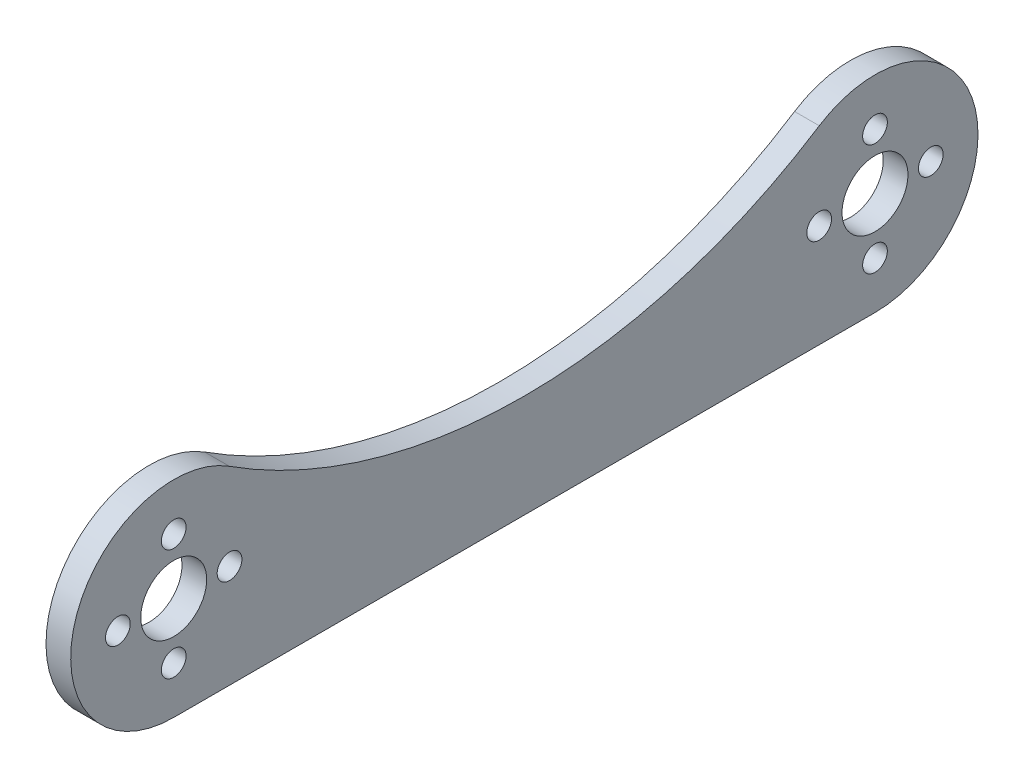
ISO-10303-21;
HEADER;
FILE_DESCRIPTION(('STEP AP214'),'2;1');
FILE_NAME('part.step','',(''),(''),'','','');
FILE_SCHEMA(('AUTOMOTIVE_DESIGN { 1 0 10303 214 1 1 1 1 }'));
ENDSEC;
DATA;
#1=APPLICATION_CONTEXT('core data for automotive mechanical design processes');
#2=APPLICATION_PROTOCOL_DEFINITION('international standard','automotive_design',2000,#1);
#3=PRODUCT_CONTEXT('',#1,'mechanical');
#4=PRODUCT('Part','Part','',(#3));
#5=PRODUCT_RELATED_PRODUCT_CATEGORY('part','',(#4));
#6=PRODUCT_DEFINITION_FORMATION('','',#4);
#7=PRODUCT_DEFINITION_CONTEXT('part definition',#1,'design');
#8=PRODUCT_DEFINITION('design','',#6,#7);
#9=PRODUCT_DEFINITION_SHAPE('','',#8);
#10=(LENGTH_UNIT() NAMED_UNIT(*) SI_UNIT(.MILLI.,.METRE.));
#11=(NAMED_UNIT(*) PLANE_ANGLE_UNIT() SI_UNIT($,.RADIAN.));
#12=(NAMED_UNIT(*) SI_UNIT($,.STERADIAN.) SOLID_ANGLE_UNIT());
#13=UNCERTAINTY_MEASURE_WITH_UNIT(LENGTH_MEASURE(1.E-05),#10,'distance_accuracy_value','');
#14=(GEOMETRIC_REPRESENTATION_CONTEXT(3) GLOBAL_UNCERTAINTY_ASSIGNED_CONTEXT((#13)) GLOBAL_UNIT_ASSIGNED_CONTEXT((#10,
#11,#12)) REPRESENTATION_CONTEXT('',''));
#15=CARTESIAN_POINT('',(0.,0.,0.));
#16=DIRECTION('',(0.,0.,1.));
#17=DIRECTION('',(1.,0.,0.));
#18=AXIS2_PLACEMENT_3D('',#15,#16,#17);
#19=CARTESIAN_POINT('',(3.,66.1701000000001,0.));
#20=DIRECTION('',(1.,0.,0.));
#21=DIRECTION('',(0.,0.,-1.));
#22=AXIS2_PLACEMENT_3D('',#19,#20,#21);
#23=PLANE('',#22);
#24=CARTESIAN_POINT('',(3.,0.,-35.775));
#25=DIRECTION('',(1.,0.,0.));
#26=DIRECTION('',(0.,0.,1.));
#27=AXIS2_PLACEMENT_3D('',#24,#25,#26);
#28=CIRCLE('',#27,1.5);
#29=CARTESIAN_POINT('',(3.,0.,-34.275));
#30=VERTEX_POINT('',#29);
#31=EDGE_CURVE('E190',#30,#30,#28,.T.);
#32=ORIENTED_EDGE('',*,*,#31,.F.);
#33=EDGE_LOOP('',(#32));
#34=FACE_BOUND('',#33,.T.);
#35=CARTESIAN_POINT('',(3.,0.,-49.325));
#36=DIRECTION('',(1.,0.,0.));
#37=DIRECTION('',(0.,0.,1.));
#38=AXIS2_PLACEMENT_3D('',#35,#36,#37);
#39=CIRCLE('',#38,1.5);
#40=CARTESIAN_POINT('',(3.,0.,-47.825));
#41=VERTEX_POINT('',#40);
#42=EDGE_CURVE('E174',#41,#41,#39,.T.);
#43=ORIENTED_EDGE('',*,*,#42,.F.);
#44=EDGE_LOOP('',(#43));
#45=FACE_BOUND('',#44,.T.);
#46=CARTESIAN_POINT('',(3.,6.77499999999998,42.55));
#47=DIRECTION('',(1.,0.,0.));
#48=DIRECTION('',(0.,0.,-1.));
#49=AXIS2_PLACEMENT_3D('',#46,#47,#48);
#50=CIRCLE('',#49,1.5);
#51=CARTESIAN_POINT('',(3.,6.77499999999998,41.05));
#52=VERTEX_POINT('',#51);
#53=EDGE_CURVE('E158',#52,#52,#50,.T.);
#54=ORIENTED_EDGE('',*,*,#53,.F.);
#55=EDGE_LOOP('',(#54));
#56=FACE_BOUND('',#55,.T.);
#57=CARTESIAN_POINT('',(3.,-6.77500000000003,42.55));
#58=DIRECTION('',(1.,0.,0.));
#59=DIRECTION('',(0.,0.,-1.));
#60=AXIS2_PLACEMENT_3D('',#57,#58,#59);
#61=CIRCLE('',#60,1.5);
#62=CARTESIAN_POINT('',(3.,-6.77500000000003,41.05));
#63=VERTEX_POINT('',#62);
#64=EDGE_CURVE('E142',#63,#63,#61,.T.);
#65=ORIENTED_EDGE('',*,*,#64,.F.);
#66=EDGE_LOOP('',(#65));
#67=FACE_BOUND('',#66,.T.);
#68=CARTESIAN_POINT('',(3.,0.,42.55));
#69=DIRECTION('',(1.,0.,0.));
#70=DIRECTION('',(0.,0.,-1.));
#71=AXIS2_PLACEMENT_3D('',#68,#69,#70);
#72=CIRCLE('',#71,4.00000000000001);
#73=CARTESIAN_POINT('',(3.,0.,38.55));
#74=VERTEX_POINT('',#73);
#75=EDGE_CURVE('E112',#74,#74,#72,.T.);
#76=ORIENTED_EDGE('',*,*,#75,.F.);
#77=EDGE_LOOP('',(#76));
#78=FACE_BOUND('',#77,.T.);
#79=CARTESIAN_POINT('',(3.,66.1701000000001,0.));
#80=DIRECTION('',(-1.,0.,0.));
#81=DIRECTION('',(0.,0.,-1.));
#82=AXIS2_PLACEMENT_3D('',#79,#80,#81);
#83=CIRCLE('',#82,66.1701000000001);
#84=CARTESIAN_POINT('',(3.,10.5138578697625,-35.7891721886714));
#85=VERTEX_POINT('',#84);
#86=CARTESIAN_POINT('',(3.,10.5138578697625,35.7891721886714));
#87=VERTEX_POINT('',#86);
#88=EDGE_CURVE('E92',#85,#87,#83,.T.);
#89=ORIENTED_EDGE('',*,*,#88,.T.);
#90=CARTESIAN_POINT('',(3.,0.,42.55));
#91=DIRECTION('',(1.,0.,0.));
#92=DIRECTION('',(0.,0.,-1.));
#93=AXIS2_PLACEMENT_3D('',#90,#91,#92);
#94=CIRCLE('',#93,12.5);
#95=CARTESIAN_POINT('',(3.,-12.5,42.55));
#96=VERTEX_POINT('',#95);
#97=EDGE_CURVE('E87',#87,#96,#94,.T.);
#98=ORIENTED_EDGE('',*,*,#97,.T.);
#99=DIRECTION('',(0.,0.,-1.));
#100=VECTOR('',#99,1.);
#101=CARTESIAN_POINT('',(3.,-12.5,42.55));
#102=LINE('',#101,#100);
#103=CARTESIAN_POINT('',(3.,-12.5,-42.55));
#104=VERTEX_POINT('',#103);
#105=EDGE_CURVE('E90',#96,#104,#102,.T.);
#106=ORIENTED_EDGE('',*,*,#105,.T.);
#107=CARTESIAN_POINT('',(3.,0.,-42.55));
#108=DIRECTION('',(1.,0.,0.));
#109=DIRECTION('',(0.,0.,1.));
#110=AXIS2_PLACEMENT_3D('',#107,#108,#109);
#111=CIRCLE('',#110,12.5);
#112=EDGE_CURVE('E57',#104,#85,#111,.T.);
#113=ORIENTED_EDGE('',*,*,#112,.T.);
#114=EDGE_LOOP('',(#89,#98,#106,#113));
#115=FACE_BOUND('',#114,.T.);
#116=CARTESIAN_POINT('',(3.,0.,35.775));
#117=DIRECTION('',(1.,0.,0.));
#118=DIRECTION('',(0.,0.,-1.));
#119=AXIS2_PLACEMENT_3D('',#116,#117,#118);
#120=CIRCLE('',#119,1.5);
#121=CARTESIAN_POINT('',(3.,0.,34.275));
#122=VERTEX_POINT('',#121);
#123=EDGE_CURVE('E134',#122,#122,#120,.T.);
#124=ORIENTED_EDGE('',*,*,#123,.F.);
#125=EDGE_LOOP('',(#124));
#126=FACE_BOUND('',#125,.T.);
#127=CARTESIAN_POINT('',(3.,0.,49.325));
#128=DIRECTION('',(1.,0.,0.));
#129=DIRECTION('',(0.,0.,-1.));
#130=AXIS2_PLACEMENT_3D('',#127,#128,#129);
#131=CIRCLE('',#130,1.49999999999999);
#132=CARTESIAN_POINT('',(3.,0.,47.825));
#133=VERTEX_POINT('',#132);
#134=EDGE_CURVE('E150',#133,#133,#131,.T.);
#135=ORIENTED_EDGE('',*,*,#134,.F.);
#136=EDGE_LOOP('',(#135));
#137=FACE_BOUND('',#136,.T.);
#138=CARTESIAN_POINT('',(3.,6.77499999999999,-42.55));
#139=DIRECTION('',(1.,0.,0.));
#140=DIRECTION('',(0.,0.,1.));
#141=AXIS2_PLACEMENT_3D('',#138,#139,#140);
#142=CIRCLE('',#141,1.5);
#143=CARTESIAN_POINT('',(3.,6.77499999999999,-41.0500000000001));
#144=VERTEX_POINT('',#143);
#145=EDGE_CURVE('E166',#144,#144,#142,.T.);
#146=ORIENTED_EDGE('',*,*,#145,.F.);
#147=EDGE_LOOP('',(#146));
#148=FACE_BOUND('',#147,.T.);
#149=CARTESIAN_POINT('',(3.,-6.77500000000002,-42.55));
#150=DIRECTION('',(1.,0.,0.));
#151=DIRECTION('',(0.,0.,1.));
#152=AXIS2_PLACEMENT_3D('',#149,#150,#151);
#153=CIRCLE('',#152,1.5);
#154=CARTESIAN_POINT('',(3.,-6.77500000000002,-41.05));
#155=VERTEX_POINT('',#154);
#156=EDGE_CURVE('E182',#155,#155,#153,.T.);
#157=ORIENTED_EDGE('',*,*,#156,.F.);
#158=EDGE_LOOP('',(#157));
#159=FACE_BOUND('',#158,.T.);
#160=CARTESIAN_POINT('',(3.,0.,-42.55));
#161=DIRECTION('',(1.,0.,0.));
#162=DIRECTION('',(0.,0.,1.));
#163=AXIS2_PLACEMENT_3D('',#160,#161,#162);
#164=CIRCLE('',#163,4.00000000000001);
#165=CARTESIAN_POINT('',(3.,0.,-38.55));
#166=VERTEX_POINT('',#165);
#167=EDGE_CURVE('E198',#166,#166,#164,.T.);
#168=ORIENTED_EDGE('',*,*,#167,.F.);
#169=EDGE_LOOP('',(#168));
#170=FACE_BOUND('',#169,.T.);
#171=ADVANCED_FACE('F39',(#34,#45,#56,#67,#78,#115,#126,#137,#148,#159,#170),#23,.T.);
#172=CARTESIAN_POINT('',(0.,66.1701000000001,0.));
#173=DIRECTION('',(1.,0.,0.));
#174=DIRECTION('',(0.,0.,-1.));
#175=AXIS2_PLACEMENT_3D('',#172,#173,#174);
#176=PLANE('',#175);
#177=CARTESIAN_POINT('',(0.,66.1701000000001,0.));
#178=DIRECTION('',(-1.,0.,0.));
#179=DIRECTION('',(0.,0.,-1.));
#180=AXIS2_PLACEMENT_3D('',#177,#178,#179);
#181=CIRCLE('',#180,66.1701000000001);
#182=CARTESIAN_POINT('',(0.,10.5138578697625,-35.7891721886714));
#183=VERTEX_POINT('',#182);
#184=CARTESIAN_POINT('',(0.,10.5138578697625,35.7891721886714));
#185=VERTEX_POINT('',#184);
#186=EDGE_CURVE('E108',#183,#185,#181,.T.);
#187=ORIENTED_EDGE('',*,*,#186,.F.);
#188=CARTESIAN_POINT('',(0.,0.,-42.55));
#189=DIRECTION('',(1.,0.,0.));
#190=DIRECTION('',(0.,0.,1.));
#191=AXIS2_PLACEMENT_3D('',#188,#189,#190);
#192=CIRCLE('',#191,12.5);
#193=CARTESIAN_POINT('',(0.,-12.5,-42.55));
#194=VERTEX_POINT('',#193);
#195=EDGE_CURVE('E80',#194,#183,#192,.T.);
#196=ORIENTED_EDGE('',*,*,#195,.F.);
#197=DIRECTION('',(0.,0.,-1.));
#198=VECTOR('',#197,1.);
#199=CARTESIAN_POINT('',(0.,-12.5,42.55));
#200=LINE('',#199,#198);
#201=CARTESIAN_POINT('',(0.,-12.5,42.55));
#202=VERTEX_POINT('',#201);
#203=EDGE_CURVE('E74',#202,#194,#200,.T.);
#204=ORIENTED_EDGE('',*,*,#203,.F.);
#205=CARTESIAN_POINT('',(0.,0.,42.55));
#206=DIRECTION('',(1.,0.,0.));
#207=DIRECTION('',(0.,0.,-1.));
#208=AXIS2_PLACEMENT_3D('',#205,#206,#207);
#209=CIRCLE('',#208,12.5);
#210=EDGE_CURVE('E97',#185,#202,#209,.T.);
#211=ORIENTED_EDGE('',*,*,#210,.F.);
#212=EDGE_LOOP('',(#187,#196,#204,#211));
#213=FACE_BOUND('',#212,.T.);
#214=CARTESIAN_POINT('',(0.,0.,42.55));
#215=DIRECTION('',(1.,0.,0.));
#216=DIRECTION('',(0.,0.,-1.));
#217=AXIS2_PLACEMENT_3D('',#214,#215,#216);
#218=CIRCLE('',#217,4.00000000000001);
#219=CARTESIAN_POINT('',(0.,0.,38.55));
#220=VERTEX_POINT('',#219);
#221=EDGE_CURVE('E130',#220,#220,#218,.T.);
#222=ORIENTED_EDGE('',*,*,#221,.T.);
#223=EDGE_LOOP('',(#222));
#224=FACE_BOUND('',#223,.T.);
#225=CARTESIAN_POINT('',(0.,0.,35.775));
#226=DIRECTION('',(1.,0.,0.));
#227=DIRECTION('',(0.,0.,-1.));
#228=AXIS2_PLACEMENT_3D('',#225,#226,#227);
#229=CIRCLE('',#228,1.5);
#230=CARTESIAN_POINT('',(0.,0.,34.275));
#231=VERTEX_POINT('',#230);
#232=EDGE_CURVE('E138',#231,#231,#229,.T.);
#233=ORIENTED_EDGE('',*,*,#232,.T.);
#234=EDGE_LOOP('',(#233));
#235=FACE_BOUND('',#234,.T.);
#236=CARTESIAN_POINT('',(0.,-6.77500000000003,42.55));
#237=DIRECTION('',(1.,0.,0.));
#238=DIRECTION('',(0.,0.,-1.));
#239=AXIS2_PLACEMENT_3D('',#236,#237,#238);
#240=CIRCLE('',#239,1.5);
#241=CARTESIAN_POINT('',(0.,-6.77500000000003,41.05));
#242=VERTEX_POINT('',#241);
#243=EDGE_CURVE('E146',#242,#242,#240,.T.);
#244=ORIENTED_EDGE('',*,*,#243,.T.);
#245=EDGE_LOOP('',(#244));
#246=FACE_BOUND('',#245,.T.);
#247=CARTESIAN_POINT('',(0.,0.,49.325));
#248=DIRECTION('',(1.,0.,0.));
#249=DIRECTION('',(0.,0.,-1.));
#250=AXIS2_PLACEMENT_3D('',#247,#248,#249);
#251=CIRCLE('',#250,1.49999999999999);
#252=CARTESIAN_POINT('',(0.,0.,47.825));
#253=VERTEX_POINT('',#252);
#254=EDGE_CURVE('E154',#253,#253,#251,.T.);
#255=ORIENTED_EDGE('',*,*,#254,.T.);
#256=EDGE_LOOP('',(#255));
#257=FACE_BOUND('',#256,.T.);
#258=CARTESIAN_POINT('',(0.,6.77499999999998,42.55));
#259=DIRECTION('',(1.,0.,0.));
#260=DIRECTION('',(0.,0.,-1.));
#261=AXIS2_PLACEMENT_3D('',#258,#259,#260);
#262=CIRCLE('',#261,1.5);
#263=CARTESIAN_POINT('',(0.,6.77499999999998,41.05));
#264=VERTEX_POINT('',#263);
#265=EDGE_CURVE('E162',#264,#264,#262,.T.);
#266=ORIENTED_EDGE('',*,*,#265,.T.);
#267=EDGE_LOOP('',(#266));
#268=FACE_BOUND('',#267,.T.);
#269=CARTESIAN_POINT('',(0.,6.77499999999999,-42.55));
#270=DIRECTION('',(1.,0.,0.));
#271=DIRECTION('',(0.,0.,1.));
#272=AXIS2_PLACEMENT_3D('',#269,#270,#271);
#273=CIRCLE('',#272,1.5);
#274=CARTESIAN_POINT('',(0.,6.77499999999999,-41.0500000000001));
#275=VERTEX_POINT('',#274);
#276=EDGE_CURVE('E170',#275,#275,#273,.T.);
#277=ORIENTED_EDGE('',*,*,#276,.T.);
#278=EDGE_LOOP('',(#277));
#279=FACE_BOUND('',#278,.T.);
#280=CARTESIAN_POINT('',(0.,0.,-49.325));
#281=DIRECTION('',(1.,0.,0.));
#282=DIRECTION('',(0.,0.,1.));
#283=AXIS2_PLACEMENT_3D('',#280,#281,#282);
#284=CIRCLE('',#283,1.5);
#285=CARTESIAN_POINT('',(0.,0.,-47.825));
#286=VERTEX_POINT('',#285);
#287=EDGE_CURVE('E178',#286,#286,#284,.T.);
#288=ORIENTED_EDGE('',*,*,#287,.T.);
#289=EDGE_LOOP('',(#288));
#290=FACE_BOUND('',#289,.T.);
#291=CARTESIAN_POINT('',(0.,-6.77500000000002,-42.55));
#292=DIRECTION('',(1.,0.,0.));
#293=DIRECTION('',(0.,0.,1.));
#294=AXIS2_PLACEMENT_3D('',#291,#292,#293);
#295=CIRCLE('',#294,1.5);
#296=CARTESIAN_POINT('',(0.,-6.77500000000002,-41.05));
#297=VERTEX_POINT('',#296);
#298=EDGE_CURVE('E186',#297,#297,#295,.T.);
#299=ORIENTED_EDGE('',*,*,#298,.T.);
#300=EDGE_LOOP('',(#299));
#301=FACE_BOUND('',#300,.T.);
#302=CARTESIAN_POINT('',(0.,0.,-35.775));
#303=DIRECTION('',(1.,0.,0.));
#304=DIRECTION('',(0.,0.,1.));
#305=AXIS2_PLACEMENT_3D('',#302,#303,#304);
#306=CIRCLE('',#305,1.5);
#307=CARTESIAN_POINT('',(0.,0.,-34.275));
#308=VERTEX_POINT('',#307);
#309=EDGE_CURVE('E194',#308,#308,#306,.T.);
#310=ORIENTED_EDGE('',*,*,#309,.T.);
#311=EDGE_LOOP('',(#310));
#312=FACE_BOUND('',#311,.T.);
#313=CARTESIAN_POINT('',(0.,0.,-42.55));
#314=DIRECTION('',(1.,0.,0.));
#315=DIRECTION('',(0.,0.,1.));
#316=AXIS2_PLACEMENT_3D('',#313,#314,#315);
#317=CIRCLE('',#316,4.00000000000001);
#318=CARTESIAN_POINT('',(0.,0.,-38.55));
#319=VERTEX_POINT('',#318);
#320=EDGE_CURVE('E202',#319,#319,#317,.T.);
#321=ORIENTED_EDGE('',*,*,#320,.T.);
#322=EDGE_LOOP('',(#321));
#323=FACE_BOUND('',#322,.T.);
#324=ADVANCED_FACE('F125',(#213,#224,#235,#246,#257,#268,#279,#290,#301,#312,#323),#176,.F.);
#325=CARTESIAN_POINT('',(3.,66.1701000000001,0.));
#326=DIRECTION('',(-1.,0.,0.));
#327=DIRECTION('',(0.,0.,1.));
#328=AXIS2_PLACEMENT_3D('',#325,#326,#327);
#329=CYLINDRICAL_SURFACE('',#328,66.1701000000001);
#330=ORIENTED_EDGE('',*,*,#186,.T.);
#331=DIRECTION('',(-1.,0.,0.));
#332=VECTOR('',#331,1.);
#333=CARTESIAN_POINT('',(3.,10.5138578697625,35.7891721886714));
#334=LINE('',#333,#332);
#335=EDGE_CURVE('E11',#87,#185,#334,.T.);
#336=ORIENTED_EDGE('',*,*,#335,.F.);
#337=ORIENTED_EDGE('',*,*,#88,.F.);
#338=DIRECTION('',(-1.,0.,0.));
#339=VECTOR('',#338,1.);
#340=CARTESIAN_POINT('',(3.,10.5138578697625,-35.7891721886714));
#341=LINE('',#340,#339);
#342=EDGE_CURVE('E104',#85,#183,#341,.T.);
#343=ORIENTED_EDGE('',*,*,#342,.T.);
#344=EDGE_LOOP('',(#330,#336,#337,#343));
#345=FACE_BOUND('',#344,.T.);
#346=ADVANCED_FACE('F41',(#345),#329,.F.);
#347=CARTESIAN_POINT('',(3.,0.,42.55));
#348=DIRECTION('',(-1.,0.,0.));
#349=DIRECTION('',(0.,0.,1.));
#350=AXIS2_PLACEMENT_3D('',#347,#348,#349);
#351=CYLINDRICAL_SURFACE('',#350,12.5);
#352=ORIENTED_EDGE('',*,*,#210,.T.);
#353=DIRECTION('',(-1.,0.,0.));
#354=VECTOR('',#353,1.);
#355=CARTESIAN_POINT('',(3.,-12.5,42.55));
#356=LINE('',#355,#354);
#357=EDGE_CURVE('E49',#96,#202,#356,.T.);
#358=ORIENTED_EDGE('',*,*,#357,.F.);
#359=ORIENTED_EDGE('',*,*,#97,.F.);
#360=ORIENTED_EDGE('',*,*,#335,.T.);
#361=EDGE_LOOP('',(#352,#358,#359,#360));
#362=FACE_BOUND('',#361,.T.);
#363=ADVANCED_FACE('F96',(#362),#351,.T.);
#364=CARTESIAN_POINT('',(3.,-12.5,42.55));
#365=DIRECTION('',(0.,1.,0.));
#366=DIRECTION('',(0.,0.,1.));
#367=AXIS2_PLACEMENT_3D('',#364,#365,#366);
#368=PLANE('',#367);
#369=ORIENTED_EDGE('',*,*,#203,.T.);
#370=DIRECTION('',(-1.,0.,0.));
#371=VECTOR('',#370,1.);
#372=CARTESIAN_POINT('',(3.,-12.5,-42.55));
#373=LINE('',#372,#371);
#374=EDGE_CURVE('E99',#104,#194,#373,.T.);
#375=ORIENTED_EDGE('',*,*,#374,.F.);
#376=ORIENTED_EDGE('',*,*,#105,.F.);
#377=ORIENTED_EDGE('',*,*,#357,.T.);
#378=EDGE_LOOP('',(#369,#375,#376,#377));
#379=FACE_BOUND('',#378,.T.);
#380=ADVANCED_FACE('F100',(#379),#368,.F.);
#381=CARTESIAN_POINT('',(3.,0.,-42.55));
#382=DIRECTION('',(-1.,0.,0.));
#383=DIRECTION('',(0.,0.,1.));
#384=AXIS2_PLACEMENT_3D('',#381,#382,#383);
#385=CYLINDRICAL_SURFACE('',#384,12.5);
#386=ORIENTED_EDGE('',*,*,#195,.T.);
#387=ORIENTED_EDGE('',*,*,#342,.F.);
#388=ORIENTED_EDGE('',*,*,#112,.F.);
#389=ORIENTED_EDGE('',*,*,#374,.T.);
#390=EDGE_LOOP('',(#386,#387,#388,#389));
#391=FACE_BOUND('',#390,.T.);
#392=ADVANCED_FACE('F122',(#391),#385,.T.);
#393=CARTESIAN_POINT('',(3.,0.,42.55));
#394=DIRECTION('',(-1.,0.,0.));
#395=DIRECTION('',(0.,0.,1.));
#396=AXIS2_PLACEMENT_3D('',#393,#394,#395);
#397=CYLINDRICAL_SURFACE('',#396,4.00000000000001);
#398=ORIENTED_EDGE('',*,*,#75,.T.);
#399=EDGE_LOOP('',(#398));
#400=FACE_BOUND('',#399,.T.);
#401=ORIENTED_EDGE('',*,*,#221,.F.);
#402=EDGE_LOOP('',(#401));
#403=FACE_BOUND('',#402,.T.);
#404=ADVANCED_FACE('F223',(#400,#403),#397,.F.);
#405=CARTESIAN_POINT('',(3.,0.,35.775));
#406=DIRECTION('',(-1.,0.,0.));
#407=DIRECTION('',(0.,0.,1.));
#408=AXIS2_PLACEMENT_3D('',#405,#406,#407);
#409=CYLINDRICAL_SURFACE('',#408,1.5);
#410=ORIENTED_EDGE('',*,*,#123,.T.);
#411=EDGE_LOOP('',(#410));
#412=FACE_BOUND('',#411,.T.);
#413=ORIENTED_EDGE('',*,*,#232,.F.);
#414=EDGE_LOOP('',(#413));
#415=FACE_BOUND('',#414,.T.);
#416=ADVANCED_FACE('F269',(#412,#415),#409,.F.);
#417=CARTESIAN_POINT('',(3.,-6.77500000000003,42.55));
#418=DIRECTION('',(-1.,0.,0.));
#419=DIRECTION('',(0.,0.,1.));
#420=AXIS2_PLACEMENT_3D('',#417,#418,#419);
#421=CYLINDRICAL_SURFACE('',#420,1.5);
#422=ORIENTED_EDGE('',*,*,#64,.T.);
#423=EDGE_LOOP('',(#422));
#424=FACE_BOUND('',#423,.T.);
#425=ORIENTED_EDGE('',*,*,#243,.F.);
#426=EDGE_LOOP('',(#425));
#427=FACE_BOUND('',#426,.T.);
#428=ADVANCED_FACE('F277',(#424,#427),#421,.F.);
#429=CARTESIAN_POINT('',(3.,0.,49.325));
#430=DIRECTION('',(-1.,0.,0.));
#431=DIRECTION('',(0.,0.,1.));
#432=AXIS2_PLACEMENT_3D('',#429,#430,#431);
#433=CYLINDRICAL_SURFACE('',#432,1.49999999999999);
#434=ORIENTED_EDGE('',*,*,#134,.T.);
#435=EDGE_LOOP('',(#434));
#436=FACE_BOUND('',#435,.T.);
#437=ORIENTED_EDGE('',*,*,#254,.F.);
#438=EDGE_LOOP('',(#437));
#439=FACE_BOUND('',#438,.T.);
#440=ADVANCED_FACE('F285',(#436,#439),#433,.F.);
#441=CARTESIAN_POINT('',(3.,6.77499999999998,42.55));
#442=DIRECTION('',(-1.,0.,0.));
#443=DIRECTION('',(0.,0.,1.));
#444=AXIS2_PLACEMENT_3D('',#441,#442,#443);
#445=CYLINDRICAL_SURFACE('',#444,1.5);
#446=ORIENTED_EDGE('',*,*,#53,.T.);
#447=EDGE_LOOP('',(#446));
#448=FACE_BOUND('',#447,.T.);
#449=ORIENTED_EDGE('',*,*,#265,.F.);
#450=EDGE_LOOP('',(#449));
#451=FACE_BOUND('',#450,.T.);
#452=ADVANCED_FACE('F294',(#448,#451),#445,.F.);
#453=CARTESIAN_POINT('',(3.,6.77499999999999,-42.55));
#454=DIRECTION('',(-1.,0.,0.));
#455=DIRECTION('',(0.,0.,1.));
#456=AXIS2_PLACEMENT_3D('',#453,#454,#455);
#457=CYLINDRICAL_SURFACE('',#456,1.5);
#458=ORIENTED_EDGE('',*,*,#145,.T.);
#459=EDGE_LOOP('',(#458));
#460=FACE_BOUND('',#459,.T.);
#461=ORIENTED_EDGE('',*,*,#276,.F.);
#462=EDGE_LOOP('',(#461));
#463=FACE_BOUND('',#462,.T.);
#464=ADVANCED_FACE('F303',(#460,#463),#457,.F.);
#465=CARTESIAN_POINT('',(3.,0.,-49.325));
#466=DIRECTION('',(-1.,0.,0.));
#467=DIRECTION('',(0.,0.,1.));
#468=AXIS2_PLACEMENT_3D('',#465,#466,#467);
#469=CYLINDRICAL_SURFACE('',#468,1.5);
#470=ORIENTED_EDGE('',*,*,#42,.T.);
#471=EDGE_LOOP('',(#470));
#472=FACE_BOUND('',#471,.T.);
#473=ORIENTED_EDGE('',*,*,#287,.F.);
#474=EDGE_LOOP('',(#473));
#475=FACE_BOUND('',#474,.T.);
#476=ADVANCED_FACE('F312',(#472,#475),#469,.F.);
#477=CARTESIAN_POINT('',(3.,-6.77500000000002,-42.55));
#478=DIRECTION('',(-1.,0.,0.));
#479=DIRECTION('',(0.,0.,1.));
#480=AXIS2_PLACEMENT_3D('',#477,#478,#479);
#481=CYLINDRICAL_SURFACE('',#480,1.5);
#482=ORIENTED_EDGE('',*,*,#156,.T.);
#483=EDGE_LOOP('',(#482));
#484=FACE_BOUND('',#483,.T.);
#485=ORIENTED_EDGE('',*,*,#298,.F.);
#486=EDGE_LOOP('',(#485));
#487=FACE_BOUND('',#486,.T.);
#488=ADVANCED_FACE('F321',(#484,#487),#481,.F.);
#489=CARTESIAN_POINT('',(3.,0.,-35.775));
#490=DIRECTION('',(-1.,0.,0.));
#491=DIRECTION('',(0.,0.,1.));
#492=AXIS2_PLACEMENT_3D('',#489,#490,#491);
#493=CYLINDRICAL_SURFACE('',#492,1.5);
#494=ORIENTED_EDGE('',*,*,#31,.T.);
#495=EDGE_LOOP('',(#494));
#496=FACE_BOUND('',#495,.T.);
#497=ORIENTED_EDGE('',*,*,#309,.F.);
#498=EDGE_LOOP('',(#497));
#499=FACE_BOUND('',#498,.T.);
#500=ADVANCED_FACE('F330',(#496,#499),#493,.F.);
#501=CARTESIAN_POINT('',(3.,0.,-42.55));
#502=DIRECTION('',(-1.,0.,0.));
#503=DIRECTION('',(0.,0.,1.));
#504=AXIS2_PLACEMENT_3D('',#501,#502,#503);
#505=CYLINDRICAL_SURFACE('',#504,4.00000000000001);
#506=ORIENTED_EDGE('',*,*,#167,.T.);
#507=EDGE_LOOP('',(#506));
#508=FACE_BOUND('',#507,.T.);
#509=ORIENTED_EDGE('',*,*,#320,.F.);
#510=EDGE_LOOP('',(#509));
#511=FACE_BOUND('',#510,.T.);
#512=ADVANCED_FACE('F210',(#508,#511),#505,.F.);
#513=CLOSED_SHELL('',(#171,#324,#346,#363,#380,#392,#404,#416,#428,#440,#452,#464,#476,#488,
#500,#512));
#514=MANIFOLD_SOLID_BREP('B2',#513);
#515=ADVANCED_BREP_SHAPE_REPRESENTATION('',(#18,#514),#14);
#516=SHAPE_DEFINITION_REPRESENTATION(#9,#515);
ENDSEC;
END-ISO-10303-21;
